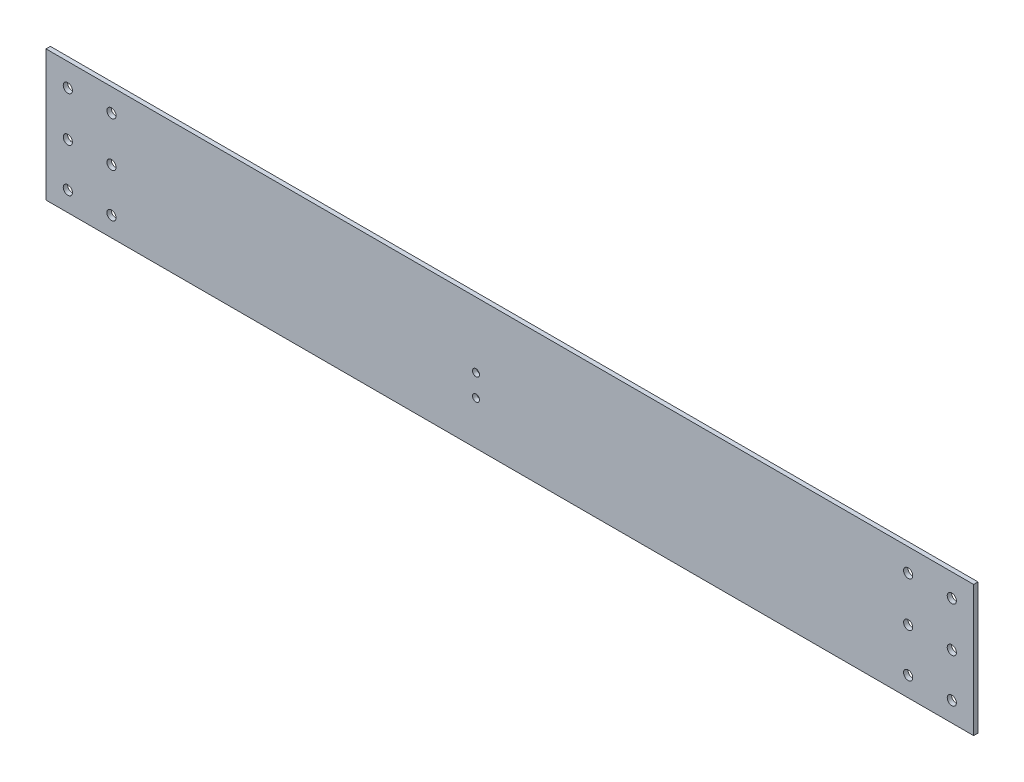
ISO-10303-21;
HEADER;
FILE_DESCRIPTION(('STEP AP214'),'2;1');
FILE_NAME('part.step','',(''),(''),'','','');
FILE_SCHEMA(('AUTOMOTIVE_DESIGN { 1 0 10303 214 1 1 1 1 }'));
ENDSEC;
DATA;
#1=APPLICATION_CONTEXT('core data for automotive mechanical design processes');
#2=APPLICATION_PROTOCOL_DEFINITION('international standard','automotive_design',2000,#1);
#3=PRODUCT_CONTEXT('',#1,'mechanical');
#4=PRODUCT('Part','Part','',(#3));
#5=PRODUCT_RELATED_PRODUCT_CATEGORY('part','',(#4));
#6=PRODUCT_DEFINITION_FORMATION('','',#4);
#7=PRODUCT_DEFINITION_CONTEXT('part definition',#1,'design');
#8=PRODUCT_DEFINITION('design','',#6,#7);
#9=PRODUCT_DEFINITION_SHAPE('','',#8);
#10=(LENGTH_UNIT() NAMED_UNIT(*) SI_UNIT(.MILLI.,.METRE.));
#11=(NAMED_UNIT(*) PLANE_ANGLE_UNIT() SI_UNIT($,.RADIAN.));
#12=(NAMED_UNIT(*) SI_UNIT($,.STERADIAN.) SOLID_ANGLE_UNIT());
#13=UNCERTAINTY_MEASURE_WITH_UNIT(LENGTH_MEASURE(1.E-05),#10,'distance_accuracy_value','');
#14=(GEOMETRIC_REPRESENTATION_CONTEXT(3) GLOBAL_UNCERTAINTY_ASSIGNED_CONTEXT((#13)) GLOBAL_UNIT_ASSIGNED_CONTEXT((#10,
#11,#12)) REPRESENTATION_CONTEXT('',''));
#15=CARTESIAN_POINT('',(0.,0.,0.));
#16=DIRECTION('',(0.,0.,1.));
#17=DIRECTION('',(1.,0.,0.));
#18=AXIS2_PLACEMENT_3D('',#15,#16,#17);
#19=CARTESIAN_POINT('',(212.5,30.,2.));
#20=DIRECTION('',(-1.,0.,0.));
#21=DIRECTION('',(0.,0.,1.));
#22=AXIS2_PLACEMENT_3D('',#19,#20,#21);
#23=PLANE('',#22);
#24=DIRECTION('',(0.,1.,0.));
#25=VECTOR('',#24,1.);
#26=CARTESIAN_POINT('',(212.5,30.,0.));
#27=LINE('',#26,#25);
#28=CARTESIAN_POINT('',(212.5,-30.,0.));
#29=VERTEX_POINT('',#28);
#30=CARTESIAN_POINT('',(212.5,30.,0.));
#31=VERTEX_POINT('',#30);
#32=EDGE_CURVE('E105',#29,#31,#27,.T.);
#33=ORIENTED_EDGE('',*,*,#32,.T.);
#34=DIRECTION('',(0.,0.,-1.));
#35=VECTOR('',#34,1.);
#36=CARTESIAN_POINT('',(212.5,30.,2.));
#37=LINE('',#36,#35);
#38=CARTESIAN_POINT('',(212.5,30.,2.));
#39=VERTEX_POINT('',#38);
#40=EDGE_CURVE('E11',#39,#31,#37,.T.);
#41=ORIENTED_EDGE('',*,*,#40,.F.);
#42=DIRECTION('',(0.,1.,0.));
#43=VECTOR('',#42,1.);
#44=CARTESIAN_POINT('',(212.5,30.,2.));
#45=LINE('',#44,#43);
#46=CARTESIAN_POINT('',(212.5,-30.,2.));
#47=VERTEX_POINT('',#46);
#48=EDGE_CURVE('E93',#47,#39,#45,.T.);
#49=ORIENTED_EDGE('',*,*,#48,.F.);
#50=DIRECTION('',(0.,0.,-1.));
#51=VECTOR('',#50,1.);
#52=CARTESIAN_POINT('',(212.5,-30.,2.));
#53=LINE('',#52,#51);
#54=EDGE_CURVE('E101',#47,#29,#53,.T.);
#55=ORIENTED_EDGE('',*,*,#54,.T.);
#56=EDGE_LOOP('',(#33,#41,#49,#55));
#57=FACE_BOUND('',#56,.T.);
#58=ADVANCED_FACE('F42',(#57),#23,.F.);
#59=CARTESIAN_POINT('',(-212.5,30.,2.));
#60=DIRECTION('',(0.,-1.,0.));
#61=DIRECTION('',(0.,0.,-1.));
#62=AXIS2_PLACEMENT_3D('',#59,#60,#61);
#63=PLANE('',#62);
#64=DIRECTION('',(-1.,0.,0.));
#65=VECTOR('',#64,1.);
#66=CARTESIAN_POINT('',(-212.5,30.,0.));
#67=LINE('',#66,#65);
#68=CARTESIAN_POINT('',(-212.5,30.,0.));
#69=VERTEX_POINT('',#68);
#70=EDGE_CURVE('E97',#31,#69,#67,.T.);
#71=ORIENTED_EDGE('',*,*,#70,.T.);
#72=DIRECTION('',(0.,0.,-1.));
#73=VECTOR('',#72,1.);
#74=CARTESIAN_POINT('',(-212.5,30.,2.));
#75=LINE('',#74,#73);
#76=CARTESIAN_POINT('',(-212.5,30.,2.));
#77=VERTEX_POINT('',#76);
#78=EDGE_CURVE('E50',#77,#69,#75,.T.);
#79=ORIENTED_EDGE('',*,*,#78,.F.);
#80=DIRECTION('',(-1.,0.,0.));
#81=VECTOR('',#80,1.);
#82=CARTESIAN_POINT('',(-212.5,30.,2.));
#83=LINE('',#82,#81);
#84=EDGE_CURVE('E88',#39,#77,#83,.T.);
#85=ORIENTED_EDGE('',*,*,#84,.F.);
#86=ORIENTED_EDGE('',*,*,#40,.T.);
#87=EDGE_LOOP('',(#71,#79,#85,#86));
#88=FACE_BOUND('',#87,.T.);
#89=ADVANCED_FACE('F96',(#88),#63,.F.);
#90=CARTESIAN_POINT('',(-212.5,30.,2.));
#91=DIRECTION('',(1.,0.,0.));
#92=DIRECTION('',(0.,0.,-1.));
#93=AXIS2_PLACEMENT_3D('',#90,#91,#92);
#94=PLANE('',#93);
#95=DIRECTION('',(0.,-1.,0.));
#96=VECTOR('',#95,1.);
#97=CARTESIAN_POINT('',(-212.5,30.,0.));
#98=LINE('',#97,#96);
#99=CARTESIAN_POINT('',(-212.5,-30.,0.));
#100=VERTEX_POINT('',#99);
#101=EDGE_CURVE('E75',#69,#100,#98,.T.);
#102=ORIENTED_EDGE('',*,*,#101,.T.);
#103=DIRECTION('',(0.,0.,-1.));
#104=VECTOR('',#103,1.);
#105=CARTESIAN_POINT('',(-212.5,-30.,2.));
#106=LINE('',#105,#104);
#107=CARTESIAN_POINT('',(-212.5,-30.,2.));
#108=VERTEX_POINT('',#107);
#109=EDGE_CURVE('E98',#108,#100,#106,.T.);
#110=ORIENTED_EDGE('',*,*,#109,.F.);
#111=DIRECTION('',(0.,-1.,0.));
#112=VECTOR('',#111,1.);
#113=CARTESIAN_POINT('',(-212.5,30.,2.));
#114=LINE('',#113,#112);
#115=EDGE_CURVE('E91',#77,#108,#114,.T.);
#116=ORIENTED_EDGE('',*,*,#115,.F.);
#117=ORIENTED_EDGE('',*,*,#78,.T.);
#118=EDGE_LOOP('',(#102,#110,#116,#117));
#119=FACE_BOUND('',#118,.T.);
#120=ADVANCED_FACE('F99',(#119),#94,.F.);
#121=CARTESIAN_POINT('',(-212.5,-30.,2.));
#122=DIRECTION('',(0.,1.,0.));
#123=DIRECTION('',(0.,0.,1.));
#124=AXIS2_PLACEMENT_3D('',#121,#122,#123);
#125=PLANE('',#124);
#126=DIRECTION('',(1.,0.,0.));
#127=VECTOR('',#126,1.);
#128=CARTESIAN_POINT('',(-212.5,-30.,0.));
#129=LINE('',#128,#127);
#130=EDGE_CURVE('E81',#100,#29,#129,.T.);
#131=ORIENTED_EDGE('',*,*,#130,.T.);
#132=ORIENTED_EDGE('',*,*,#54,.F.);
#133=DIRECTION('',(1.,0.,0.));
#134=VECTOR('',#133,1.);
#135=CARTESIAN_POINT('',(-212.5,-30.,2.));
#136=LINE('',#135,#134);
#137=EDGE_CURVE('E58',#108,#47,#136,.T.);
#138=ORIENTED_EDGE('',*,*,#137,.F.);
#139=ORIENTED_EDGE('',*,*,#109,.T.);
#140=EDGE_LOOP('',(#131,#132,#138,#139));
#141=FACE_BOUND('',#140,.T.);
#142=ADVANCED_FACE('F113',(#141),#125,.F.);
#143=CARTESIAN_POINT('',(0.,0.,2.));
#144=DIRECTION('',(0.,0.,1.));
#145=DIRECTION('',(1.,0.,0.));
#146=AXIS2_PLACEMENT_3D('',#143,#144,#145);
#147=PLANE('',#146);
#148=CARTESIAN_POINT('',(-182.5,19.5,2.));
#149=DIRECTION('',(0.,0.,-1.));
#150=DIRECTION('',(-1.,0.,0.));
#151=AXIS2_PLACEMENT_3D('',#148,#149,#150);
#152=CIRCLE('',#151,2.09999999999999);
#153=CARTESIAN_POINT('',(-184.6,19.5,2.));
#154=VERTEX_POINT('',#153);
#155=EDGE_CURVE('E156',#154,#154,#152,.T.);
#156=ORIENTED_EDGE('',*,*,#155,.T.);
#157=EDGE_LOOP('',(#156));
#158=FACE_BOUND('',#157,.T.);
#159=CARTESIAN_POINT('',(-15.5,-10.,2.));
#160=DIRECTION('',(0.,0.,-1.));
#161=DIRECTION('',(-1.,0.,0.));
#162=AXIS2_PLACEMENT_3D('',#159,#160,#161);
#163=CIRCLE('',#162,1.6);
#164=CARTESIAN_POINT('',(-17.1,-10.,2.));
#165=VERTEX_POINT('',#164);
#166=EDGE_CURVE('E149',#165,#165,#163,.T.);
#167=ORIENTED_EDGE('',*,*,#166,.T.);
#168=EDGE_LOOP('',(#167));
#169=FACE_BOUND('',#168,.T.);
#170=CARTESIAN_POINT('',(-15.5,0.,2.));
#171=DIRECTION('',(0.,0.,-1.));
#172=DIRECTION('',(-1.,0.,0.));
#173=AXIS2_PLACEMENT_3D('',#170,#171,#172);
#174=CIRCLE('',#173,1.6);
#175=CARTESIAN_POINT('',(-17.1,0.,2.));
#176=VERTEX_POINT('',#175);
#177=EDGE_CURVE('E168',#176,#176,#174,.T.);
#178=ORIENTED_EDGE('',*,*,#177,.T.);
#179=EDGE_LOOP('',(#178));
#180=FACE_BOUND('',#179,.T.);
#181=CARTESIAN_POINT('',(182.5,-21.,2.));
#182=DIRECTION('',(0.,0.,-1.));
#183=DIRECTION('',(-1.,0.,0.));
#184=AXIS2_PLACEMENT_3D('',#181,#182,#183);
#185=CIRCLE('',#184,2.10000000000002);
#186=CARTESIAN_POINT('',(180.4,-21.,2.));
#187=VERTEX_POINT('',#186);
#188=EDGE_CURVE('E161',#187,#187,#185,.T.);
#189=ORIENTED_EDGE('',*,*,#188,.T.);
#190=EDGE_LOOP('',(#189));
#191=FACE_BOUND('',#190,.T.);
#192=CARTESIAN_POINT('',(-182.5,-21.,2.));
#193=DIRECTION('',(0.,0.,-1.));
#194=DIRECTION('',(-1.,0.,0.));
#195=AXIS2_PLACEMENT_3D('',#192,#193,#194);
#196=CIRCLE('',#195,2.09999999999999);
#197=CARTESIAN_POINT('',(-184.6,-21.,2.));
#198=VERTEX_POINT('',#197);
#199=EDGE_CURVE('E132',#198,#198,#196,.T.);
#200=ORIENTED_EDGE('',*,*,#199,.T.);
#201=EDGE_LOOP('',(#200));
#202=FACE_BOUND('',#201,.T.);
#203=CARTESIAN_POINT('',(-202.5,19.5,2.));
#204=DIRECTION('',(0.,0.,-1.));
#205=DIRECTION('',(-1.,0.,0.));
#206=AXIS2_PLACEMENT_3D('',#203,#204,#205);
#207=CIRCLE('',#206,2.10000000000002);
#208=CARTESIAN_POINT('',(-204.6,19.5,2.));
#209=VERTEX_POINT('',#208);
#210=EDGE_CURVE('E125',#209,#209,#207,.T.);
#211=ORIENTED_EDGE('',*,*,#210,.T.);
#212=EDGE_LOOP('',(#211));
#213=FACE_BOUND('',#212,.T.);
#214=CARTESIAN_POINT('',(-202.5,-1.00000000000002,2.));
#215=DIRECTION('',(0.,0.,-1.));
#216=DIRECTION('',(-1.,0.,0.));
#217=AXIS2_PLACEMENT_3D('',#214,#215,#216);
#218=CIRCLE('',#217,2.10000000000002);
#219=CARTESIAN_POINT('',(-204.6,-1.00000000000002,2.));
#220=VERTEX_POINT('',#219);
#221=EDGE_CURVE('E144',#220,#220,#218,.T.);
#222=ORIENTED_EDGE('',*,*,#221,.T.);
#223=EDGE_LOOP('',(#222));
#224=FACE_BOUND('',#223,.T.);
#225=CARTESIAN_POINT('',(-182.5,-1.00000000000001,2.));
#226=DIRECTION('',(0.,0.,-1.));
#227=DIRECTION('',(-1.,0.,0.));
#228=AXIS2_PLACEMENT_3D('',#225,#226,#227);
#229=CIRCLE('',#228,2.09999999999999);
#230=CARTESIAN_POINT('',(-184.6,-1.00000000000001,2.));
#231=VERTEX_POINT('',#230);
#232=EDGE_CURVE('E137',#231,#231,#229,.T.);
#233=ORIENTED_EDGE('',*,*,#232,.T.);
#234=EDGE_LOOP('',(#233));
#235=FACE_BOUND('',#234,.T.);
#236=CARTESIAN_POINT('',(182.5,19.5,2.));
#237=DIRECTION('',(0.,0.,-1.));
#238=DIRECTION('',(-1.,0.,0.));
#239=AXIS2_PLACEMENT_3D('',#236,#237,#238);
#240=CIRCLE('',#239,2.09999999999999);
#241=CARTESIAN_POINT('',(180.4,19.5,2.));
#242=VERTEX_POINT('',#241);
#243=EDGE_CURVE('E197',#242,#242,#240,.T.);
#244=ORIENTED_EDGE('',*,*,#243,.T.);
#245=EDGE_LOOP('',(#244));
#246=FACE_BOUND('',#245,.T.);
#247=CARTESIAN_POINT('',(202.5,-21.,2.));
#248=DIRECTION('',(0.,0.,-1.));
#249=DIRECTION('',(-1.,0.,0.));
#250=AXIS2_PLACEMENT_3D('',#247,#248,#249);
#251=CIRCLE('',#250,2.10000000000002);
#252=CARTESIAN_POINT('',(200.4,-21.,2.));
#253=VERTEX_POINT('',#252);
#254=EDGE_CURVE('E180',#253,#253,#251,.T.);
#255=ORIENTED_EDGE('',*,*,#254,.T.);
#256=EDGE_LOOP('',(#255));
#257=FACE_BOUND('',#256,.T.);
#258=CARTESIAN_POINT('',(182.5,-1.00000000000002,2.));
#259=DIRECTION('',(0.,0.,-1.));
#260=DIRECTION('',(-1.,0.,0.));
#261=AXIS2_PLACEMENT_3D('',#258,#259,#260);
#262=CIRCLE('',#261,2.09999999999999);
#263=CARTESIAN_POINT('',(180.4,-1.00000000000002,2.));
#264=VERTEX_POINT('',#263);
#265=EDGE_CURVE('E173',#264,#264,#262,.T.);
#266=ORIENTED_EDGE('',*,*,#265,.T.);
#267=EDGE_LOOP('',(#266));
#268=FACE_BOUND('',#267,.T.);
#269=CARTESIAN_POINT('',(202.5,-1.00000000000003,2.));
#270=DIRECTION('',(0.,0.,-1.));
#271=DIRECTION('',(-1.,0.,0.));
#272=AXIS2_PLACEMENT_3D('',#269,#270,#271);
#273=CIRCLE('',#272,2.10000000000002);
#274=CARTESIAN_POINT('',(200.4,-1.00000000000003,2.));
#275=VERTEX_POINT('',#274);
#276=EDGE_CURVE('E192',#275,#275,#273,.T.);
#277=ORIENTED_EDGE('',*,*,#276,.T.);
#278=EDGE_LOOP('',(#277));
#279=FACE_BOUND('',#278,.T.);
#280=CARTESIAN_POINT('',(202.5,19.5,2.));
#281=DIRECTION('',(0.,0.,-1.));
#282=DIRECTION('',(-1.,0.,0.));
#283=AXIS2_PLACEMENT_3D('',#280,#281,#282);
#284=CIRCLE('',#283,2.10000000000002);
#285=CARTESIAN_POINT('',(200.4,19.5,2.));
#286=VERTEX_POINT('',#285);
#287=EDGE_CURVE('E185',#286,#286,#284,.T.);
#288=ORIENTED_EDGE('',*,*,#287,.T.);
#289=EDGE_LOOP('',(#288));
#290=FACE_BOUND('',#289,.T.);
#291=CARTESIAN_POINT('',(-202.5,-21.,2.));
#292=DIRECTION('',(0.,0.,-1.));
#293=DIRECTION('',(-1.,0.,0.));
#294=AXIS2_PLACEMENT_3D('',#291,#292,#293);
#295=CIRCLE('',#294,2.10000000000002);
#296=CARTESIAN_POINT('',(-204.6,-21.,2.));
#297=VERTEX_POINT('',#296);
#298=EDGE_CURVE('E108',#297,#297,#295,.T.);
#299=ORIENTED_EDGE('',*,*,#298,.T.);
#300=EDGE_LOOP('',(#299));
#301=FACE_BOUND('',#300,.T.);
#302=ORIENTED_EDGE('',*,*,#48,.T.);
#303=ORIENTED_EDGE('',*,*,#84,.T.);
#304=ORIENTED_EDGE('',*,*,#115,.T.);
#305=ORIENTED_EDGE('',*,*,#137,.T.);
#306=EDGE_LOOP('',(#302,#303,#304,#305));
#307=FACE_BOUND('',#306,.T.);
#308=ADVANCED_FACE('F89',(#158,#169,#180,#191,#202,#213,#224,#235,#246,#257,#268,#279,#290,#301,
#307),#147,.T.);
#309=CARTESIAN_POINT('',(0.,0.,0.));
#310=DIRECTION('',(0.,0.,1.));
#311=DIRECTION('',(1.,0.,0.));
#312=AXIS2_PLACEMENT_3D('',#309,#310,#311);
#313=PLANE('',#312);
#314=CARTESIAN_POINT('',(-182.5,19.5,0.));
#315=DIRECTION('',(0.,0.,-1.));
#316=DIRECTION('',(-1.,0.,0.));
#317=AXIS2_PLACEMENT_3D('',#314,#315,#316);
#318=CIRCLE('',#317,2.09999999999999);
#319=CARTESIAN_POINT('',(-184.6,19.5,0.));
#320=VERTEX_POINT('',#319);
#321=EDGE_CURVE('E141',#320,#320,#318,.T.);
#322=ORIENTED_EDGE('',*,*,#321,.F.);
#323=EDGE_LOOP('',(#322));
#324=FACE_BOUND('',#323,.T.);
#325=CARTESIAN_POINT('',(-15.5,-10.,0.));
#326=DIRECTION('',(0.,0.,-1.));
#327=DIRECTION('',(-1.,0.,0.));
#328=AXIS2_PLACEMENT_3D('',#325,#326,#327);
#329=CIRCLE('',#328,1.6);
#330=CARTESIAN_POINT('',(-17.1,-10.,0.));
#331=VERTEX_POINT('',#330);
#332=EDGE_CURVE('E152',#331,#331,#329,.T.);
#333=ORIENTED_EDGE('',*,*,#332,.F.);
#334=EDGE_LOOP('',(#333));
#335=FACE_BOUND('',#334,.T.);
#336=CARTESIAN_POINT('',(-15.5,0.,0.));
#337=DIRECTION('',(0.,0.,-1.));
#338=DIRECTION('',(-1.,0.,0.));
#339=AXIS2_PLACEMENT_3D('',#336,#337,#338);
#340=CIRCLE('',#339,1.6);
#341=CARTESIAN_POINT('',(-17.1,0.,0.));
#342=VERTEX_POINT('',#341);
#343=EDGE_CURVE('E153',#342,#342,#340,.T.);
#344=ORIENTED_EDGE('',*,*,#343,.F.);
#345=EDGE_LOOP('',(#344));
#346=FACE_BOUND('',#345,.T.);
#347=CARTESIAN_POINT('',(182.5,-21.,0.));
#348=DIRECTION('',(0.,0.,-1.));
#349=DIRECTION('',(-1.,0.,0.));
#350=AXIS2_PLACEMENT_3D('',#347,#348,#349);
#351=CIRCLE('',#350,2.10000000000002);
#352=CARTESIAN_POINT('',(180.4,-21.,0.));
#353=VERTEX_POINT('',#352);
#354=EDGE_CURVE('E164',#353,#353,#351,.T.);
#355=ORIENTED_EDGE('',*,*,#354,.F.);
#356=EDGE_LOOP('',(#355));
#357=FACE_BOUND('',#356,.T.);
#358=CARTESIAN_POINT('',(-182.5,-21.,0.));
#359=DIRECTION('',(0.,0.,-1.));
#360=DIRECTION('',(-1.,0.,0.));
#361=AXIS2_PLACEMENT_3D('',#358,#359,#360);
#362=CIRCLE('',#361,2.09999999999999);
#363=CARTESIAN_POINT('',(-184.6,-21.,0.));
#364=VERTEX_POINT('',#363);
#365=EDGE_CURVE('E122',#364,#364,#362,.T.);
#366=ORIENTED_EDGE('',*,*,#365,.F.);
#367=EDGE_LOOP('',(#366));
#368=FACE_BOUND('',#367,.T.);
#369=CARTESIAN_POINT('',(-202.5,19.5,0.));
#370=DIRECTION('',(0.,0.,-1.));
#371=DIRECTION('',(-1.,0.,0.));
#372=AXIS2_PLACEMENT_3D('',#369,#370,#371);
#373=CIRCLE('',#372,2.10000000000002);
#374=CARTESIAN_POINT('',(-204.6,19.5,0.));
#375=VERTEX_POINT('',#374);
#376=EDGE_CURVE('E128',#375,#375,#373,.T.);
#377=ORIENTED_EDGE('',*,*,#376,.F.);
#378=EDGE_LOOP('',(#377));
#379=FACE_BOUND('',#378,.T.);
#380=CARTESIAN_POINT('',(-202.5,-1.00000000000002,0.));
#381=DIRECTION('',(0.,0.,-1.));
#382=DIRECTION('',(-1.,0.,0.));
#383=AXIS2_PLACEMENT_3D('',#380,#381,#382);
#384=CIRCLE('',#383,2.10000000000002);
#385=CARTESIAN_POINT('',(-204.6,-1.00000000000002,0.));
#386=VERTEX_POINT('',#385);
#387=EDGE_CURVE('E129',#386,#386,#384,.T.);
#388=ORIENTED_EDGE('',*,*,#387,.F.);
#389=EDGE_LOOP('',(#388));
#390=FACE_BOUND('',#389,.T.);
#391=CARTESIAN_POINT('',(-182.5,-1.00000000000001,0.));
#392=DIRECTION('',(0.,0.,-1.));
#393=DIRECTION('',(-1.,0.,0.));
#394=AXIS2_PLACEMENT_3D('',#391,#392,#393);
#395=CIRCLE('',#394,2.09999999999999);
#396=CARTESIAN_POINT('',(-184.6,-1.00000000000001,0.));
#397=VERTEX_POINT('',#396);
#398=EDGE_CURVE('E140',#397,#397,#395,.T.);
#399=ORIENTED_EDGE('',*,*,#398,.F.);
#400=EDGE_LOOP('',(#399));
#401=FACE_BOUND('',#400,.T.);
#402=CARTESIAN_POINT('',(182.5,19.5,0.));
#403=DIRECTION('',(0.,0.,-1.));
#404=DIRECTION('',(-1.,0.,0.));
#405=AXIS2_PLACEMENT_3D('',#402,#403,#404);
#406=CIRCLE('',#405,2.09999999999999);
#407=CARTESIAN_POINT('',(180.4,19.5,0.));
#408=VERTEX_POINT('',#407);
#409=EDGE_CURVE('E189',#408,#408,#406,.T.);
#410=ORIENTED_EDGE('',*,*,#409,.F.);
#411=EDGE_LOOP('',(#410));
#412=FACE_BOUND('',#411,.T.);
#413=CARTESIAN_POINT('',(202.5,-21.,0.));
#414=DIRECTION('',(0.,0.,-1.));
#415=DIRECTION('',(-1.,0.,0.));
#416=AXIS2_PLACEMENT_3D('',#413,#414,#415);
#417=CIRCLE('',#416,2.10000000000002);
#418=CARTESIAN_POINT('',(200.4,-21.,0.));
#419=VERTEX_POINT('',#418);
#420=EDGE_CURVE('E165',#419,#419,#417,.T.);
#421=ORIENTED_EDGE('',*,*,#420,.F.);
#422=EDGE_LOOP('',(#421));
#423=FACE_BOUND('',#422,.T.);
#424=CARTESIAN_POINT('',(182.5,-1.00000000000002,0.));
#425=DIRECTION('',(0.,0.,-1.));
#426=DIRECTION('',(-1.,0.,0.));
#427=AXIS2_PLACEMENT_3D('',#424,#425,#426);
#428=CIRCLE('',#427,2.09999999999999);
#429=CARTESIAN_POINT('',(180.4,-1.00000000000002,0.));
#430=VERTEX_POINT('',#429);
#431=EDGE_CURVE('E176',#430,#430,#428,.T.);
#432=ORIENTED_EDGE('',*,*,#431,.F.);
#433=EDGE_LOOP('',(#432));
#434=FACE_BOUND('',#433,.T.);
#435=CARTESIAN_POINT('',(202.5,-1.00000000000003,0.));
#436=DIRECTION('',(0.,0.,-1.));
#437=DIRECTION('',(-1.,0.,0.));
#438=AXIS2_PLACEMENT_3D('',#435,#436,#437);
#439=CIRCLE('',#438,2.10000000000002);
#440=CARTESIAN_POINT('',(200.4,-1.00000000000003,0.));
#441=VERTEX_POINT('',#440);
#442=EDGE_CURVE('E177',#441,#441,#439,.T.);
#443=ORIENTED_EDGE('',*,*,#442,.F.);
#444=EDGE_LOOP('',(#443));
#445=FACE_BOUND('',#444,.T.);
#446=CARTESIAN_POINT('',(202.5,19.5,0.));
#447=DIRECTION('',(0.,0.,-1.));
#448=DIRECTION('',(-1.,0.,0.));
#449=AXIS2_PLACEMENT_3D('',#446,#447,#448);
#450=CIRCLE('',#449,2.10000000000002);
#451=CARTESIAN_POINT('',(200.4,19.5,0.));
#452=VERTEX_POINT('',#451);
#453=EDGE_CURVE('E188',#452,#452,#450,.T.);
#454=ORIENTED_EDGE('',*,*,#453,.F.);
#455=EDGE_LOOP('',(#454));
#456=FACE_BOUND('',#455,.T.);
#457=CARTESIAN_POINT('',(-202.5,-21.,0.));
#458=DIRECTION('',(0.,0.,-1.));
#459=DIRECTION('',(-1.,0.,0.));
#460=AXIS2_PLACEMENT_3D('',#457,#458,#459);
#461=CIRCLE('',#460,2.10000000000002);
#462=CARTESIAN_POINT('',(-204.6,-21.,0.));
#463=VERTEX_POINT('',#462);
#464=EDGE_CURVE('E119',#463,#463,#461,.T.);
#465=ORIENTED_EDGE('',*,*,#464,.F.);
#466=EDGE_LOOP('',(#465));
#467=FACE_BOUND('',#466,.T.);
#468=ORIENTED_EDGE('',*,*,#32,.F.);
#469=ORIENTED_EDGE('',*,*,#130,.F.);
#470=ORIENTED_EDGE('',*,*,#101,.F.);
#471=ORIENTED_EDGE('',*,*,#70,.F.);
#472=EDGE_LOOP('',(#468,#469,#470,#471));
#473=FACE_BOUND('',#472,.T.);
#474=ADVANCED_FACE('F116',(#324,#335,#346,#357,#368,#379,#390,#401,#412,#423,#434,#445,#456,
#467,#473),#313,.F.);
#475=CARTESIAN_POINT('',(-202.5,-21.,2.));
#476=DIRECTION('',(0.,0.,-1.));
#477=DIRECTION('',(-1.,0.,0.));
#478=AXIS2_PLACEMENT_3D('',#475,#476,#477);
#479=CYLINDRICAL_SURFACE('',#478,2.10000000000002);
#480=ORIENTED_EDGE('',*,*,#298,.F.);
#481=EDGE_LOOP('',(#480));
#482=FACE_BOUND('',#481,.T.);
#483=ORIENTED_EDGE('',*,*,#464,.T.);
#484=EDGE_LOOP('',(#483));
#485=FACE_BOUND('',#484,.T.);
#486=ADVANCED_FACE('F207',(#482,#485),#479,.F.);
#487=CARTESIAN_POINT('',(202.5,19.5,2.));
#488=DIRECTION('',(0.,0.,-1.));
#489=DIRECTION('',(-1.,0.,0.));
#490=AXIS2_PLACEMENT_3D('',#487,#488,#489);
#491=CYLINDRICAL_SURFACE('',#490,2.10000000000002);
#492=ORIENTED_EDGE('',*,*,#287,.F.);
#493=EDGE_LOOP('',(#492));
#494=FACE_BOUND('',#493,.T.);
#495=ORIENTED_EDGE('',*,*,#453,.T.);
#496=EDGE_LOOP('',(#495));
#497=FACE_BOUND('',#496,.T.);
#498=ADVANCED_FACE('F221',(#494,#497),#491,.F.);
#499=CARTESIAN_POINT('',(202.5,-1.00000000000003,2.));
#500=DIRECTION('',(0.,0.,-1.));
#501=DIRECTION('',(-1.,0.,0.));
#502=AXIS2_PLACEMENT_3D('',#499,#500,#501);
#503=CYLINDRICAL_SURFACE('',#502,2.10000000000002);
#504=ORIENTED_EDGE('',*,*,#276,.F.);
#505=EDGE_LOOP('',(#504));
#506=FACE_BOUND('',#505,.T.);
#507=ORIENTED_EDGE('',*,*,#442,.T.);
#508=EDGE_LOOP('',(#507));
#509=FACE_BOUND('',#508,.T.);
#510=ADVANCED_FACE('F228',(#506,#509),#503,.F.);
#511=CARTESIAN_POINT('',(182.5,-1.00000000000002,2.));
#512=DIRECTION('',(0.,0.,-1.));
#513=DIRECTION('',(-1.,0.,0.));
#514=AXIS2_PLACEMENT_3D('',#511,#512,#513);
#515=CYLINDRICAL_SURFACE('',#514,2.09999999999999);
#516=ORIENTED_EDGE('',*,*,#265,.F.);
#517=EDGE_LOOP('',(#516));
#518=FACE_BOUND('',#517,.T.);
#519=ORIENTED_EDGE('',*,*,#431,.T.);
#520=EDGE_LOOP('',(#519));
#521=FACE_BOUND('',#520,.T.);
#522=ADVANCED_FACE('F279',(#518,#521),#515,.F.);
#523=CARTESIAN_POINT('',(202.5,-21.,2.));
#524=DIRECTION('',(0.,0.,-1.));
#525=DIRECTION('',(-1.,0.,0.));
#526=AXIS2_PLACEMENT_3D('',#523,#524,#525);
#527=CYLINDRICAL_SURFACE('',#526,2.10000000000002);
#528=ORIENTED_EDGE('',*,*,#254,.F.);
#529=EDGE_LOOP('',(#528));
#530=FACE_BOUND('',#529,.T.);
#531=ORIENTED_EDGE('',*,*,#420,.T.);
#532=EDGE_LOOP('',(#531));
#533=FACE_BOUND('',#532,.T.);
#534=ADVANCED_FACE('F284',(#530,#533),#527,.F.);
#535=CARTESIAN_POINT('',(182.5,19.5,2.));
#536=DIRECTION('',(0.,0.,-1.));
#537=DIRECTION('',(-1.,0.,0.));
#538=AXIS2_PLACEMENT_3D('',#535,#536,#537);
#539=CYLINDRICAL_SURFACE('',#538,2.09999999999999);
#540=ORIENTED_EDGE('',*,*,#243,.F.);
#541=EDGE_LOOP('',(#540));
#542=FACE_BOUND('',#541,.T.);
#543=ORIENTED_EDGE('',*,*,#409,.T.);
#544=EDGE_LOOP('',(#543));
#545=FACE_BOUND('',#544,.T.);
#546=ADVANCED_FACE('F203',(#542,#545),#539,.F.);
#547=CARTESIAN_POINT('',(-182.5,-1.00000000000001,2.));
#548=DIRECTION('',(0.,0.,-1.));
#549=DIRECTION('',(-1.,0.,0.));
#550=AXIS2_PLACEMENT_3D('',#547,#548,#549);
#551=CYLINDRICAL_SURFACE('',#550,2.09999999999999);
#552=ORIENTED_EDGE('',*,*,#232,.F.);
#553=EDGE_LOOP('',(#552));
#554=FACE_BOUND('',#553,.T.);
#555=ORIENTED_EDGE('',*,*,#398,.T.);
#556=EDGE_LOOP('',(#555));
#557=FACE_BOUND('',#556,.T.);
#558=ADVANCED_FACE('F313',(#554,#557),#551,.F.);
#559=CARTESIAN_POINT('',(-202.5,-1.00000000000002,2.));
#560=DIRECTION('',(0.,0.,-1.));
#561=DIRECTION('',(-1.,0.,0.));
#562=AXIS2_PLACEMENT_3D('',#559,#560,#561);
#563=CYLINDRICAL_SURFACE('',#562,2.10000000000002);
#564=ORIENTED_EDGE('',*,*,#221,.F.);
#565=EDGE_LOOP('',(#564));
#566=FACE_BOUND('',#565,.T.);
#567=ORIENTED_EDGE('',*,*,#387,.T.);
#568=EDGE_LOOP('',(#567));
#569=FACE_BOUND('',#568,.T.);
#570=ADVANCED_FACE('F309',(#566,#569),#563,.F.);
#571=CARTESIAN_POINT('',(-202.5,19.5,2.));
#572=DIRECTION('',(0.,0.,-1.));
#573=DIRECTION('',(-1.,0.,0.));
#574=AXIS2_PLACEMENT_3D('',#571,#572,#573);
#575=CYLINDRICAL_SURFACE('',#574,2.10000000000002);
#576=ORIENTED_EDGE('',*,*,#210,.F.);
#577=EDGE_LOOP('',(#576));
#578=FACE_BOUND('',#577,.T.);
#579=ORIENTED_EDGE('',*,*,#376,.T.);
#580=EDGE_LOOP('',(#579));
#581=FACE_BOUND('',#580,.T.);
#582=ADVANCED_FACE('F312',(#578,#581),#575,.F.);
#583=CARTESIAN_POINT('',(-182.5,-21.,2.));
#584=DIRECTION('',(0.,0.,-1.));
#585=DIRECTION('',(-1.,0.,0.));
#586=AXIS2_PLACEMENT_3D('',#583,#584,#585);
#587=CYLINDRICAL_SURFACE('',#586,2.09999999999999);
#588=ORIENTED_EDGE('',*,*,#199,.F.);
#589=EDGE_LOOP('',(#588));
#590=FACE_BOUND('',#589,.T.);
#591=ORIENTED_EDGE('',*,*,#365,.T.);
#592=EDGE_LOOP('',(#591));
#593=FACE_BOUND('',#592,.T.);
#594=ADVANCED_FACE('F300',(#590,#593),#587,.F.);
#595=CARTESIAN_POINT('',(182.5,-21.,2.));
#596=DIRECTION('',(0.,0.,-1.));
#597=DIRECTION('',(-1.,0.,0.));
#598=AXIS2_PLACEMENT_3D('',#595,#596,#597);
#599=CYLINDRICAL_SURFACE('',#598,2.10000000000002);
#600=ORIENTED_EDGE('',*,*,#188,.F.);
#601=EDGE_LOOP('',(#600));
#602=FACE_BOUND('',#601,.T.);
#603=ORIENTED_EDGE('',*,*,#354,.T.);
#604=EDGE_LOOP('',(#603));
#605=FACE_BOUND('',#604,.T.);
#606=ADVANCED_FACE('F296',(#602,#605),#599,.F.);
#607=CARTESIAN_POINT('',(-15.5,0.,2.));
#608=DIRECTION('',(0.,0.,-1.));
#609=DIRECTION('',(-1.,0.,0.));
#610=AXIS2_PLACEMENT_3D('',#607,#608,#609);
#611=CYLINDRICAL_SURFACE('',#610,1.6);
#612=ORIENTED_EDGE('',*,*,#177,.F.);
#613=EDGE_LOOP('',(#612));
#614=FACE_BOUND('',#613,.T.);
#615=ORIENTED_EDGE('',*,*,#343,.T.);
#616=EDGE_LOOP('',(#615));
#617=FACE_BOUND('',#616,.T.);
#618=ADVANCED_FACE('F292',(#614,#617),#611,.F.);
#619=CARTESIAN_POINT('',(-15.5,-10.,2.));
#620=DIRECTION('',(0.,0.,-1.));
#621=DIRECTION('',(-1.,0.,0.));
#622=AXIS2_PLACEMENT_3D('',#619,#620,#621);
#623=CYLINDRICAL_SURFACE('',#622,1.6);
#624=ORIENTED_EDGE('',*,*,#166,.F.);
#625=EDGE_LOOP('',(#624));
#626=FACE_BOUND('',#625,.T.);
#627=ORIENTED_EDGE('',*,*,#332,.T.);
#628=EDGE_LOOP('',(#627));
#629=FACE_BOUND('',#628,.T.);
#630=ADVANCED_FACE('F295',(#626,#629),#623,.F.);
#631=CARTESIAN_POINT('',(-182.5,19.5,2.));
#632=DIRECTION('',(0.,0.,-1.));
#633=DIRECTION('',(-1.,0.,0.));
#634=AXIS2_PLACEMENT_3D('',#631,#632,#633);
#635=CYLINDRICAL_SURFACE('',#634,2.09999999999999);
#636=ORIENTED_EDGE('',*,*,#155,.F.);
#637=EDGE_LOOP('',(#636));
#638=FACE_BOUND('',#637,.T.);
#639=ORIENTED_EDGE('',*,*,#321,.T.);
#640=EDGE_LOOP('',(#639));
#641=FACE_BOUND('',#640,.T.);
#642=ADVANCED_FACE('F302',(#638,#641),#635,.F.);
#643=CLOSED_SHELL('',(#58,#89,#120,#142,#308,#474,#486,#498,#510,#522,#534,#546,#558,#570,#582,
#594,#606,#618,#630,#642));
#644=MANIFOLD_SOLID_BREP('B2',#643);
#645=ADVANCED_BREP_SHAPE_REPRESENTATION('',(#18,#644),#14);
#646=SHAPE_DEFINITION_REPRESENTATION(#9,#645);
ENDSEC;
END-ISO-10303-21;
